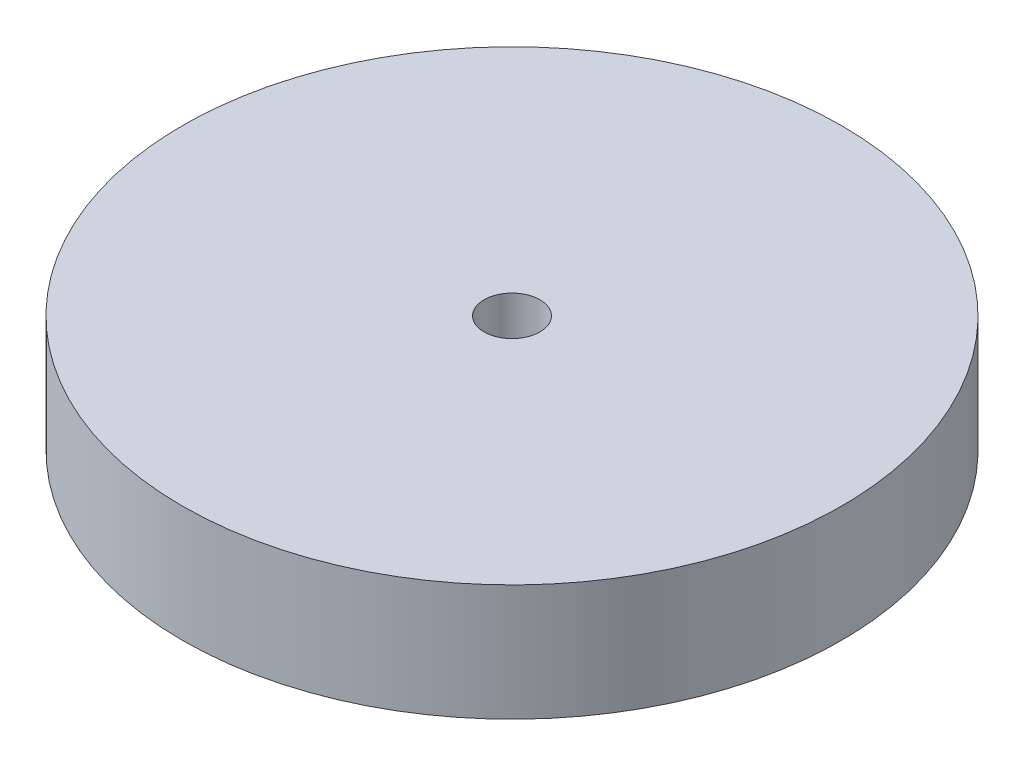
ISO-10303-21;
HEADER;
FILE_DESCRIPTION(('STEP AP214'),'2;1');
FILE_NAME('part.step','',(''),(''),'','','');
FILE_SCHEMA(('AUTOMOTIVE_DESIGN { 1 0 10303 214 1 1 1 1 }'));
ENDSEC;
DATA;
#1=APPLICATION_CONTEXT('core data for automotive mechanical design processes');
#2=APPLICATION_PROTOCOL_DEFINITION('international standard','automotive_design',2000,#1);
#3=PRODUCT_CONTEXT('',#1,'mechanical');
#4=PRODUCT('Part','Part','',(#3));
#5=PRODUCT_RELATED_PRODUCT_CATEGORY('part','',(#4));
#6=PRODUCT_DEFINITION_FORMATION('','',#4);
#7=PRODUCT_DEFINITION_CONTEXT('part definition',#1,'design');
#8=PRODUCT_DEFINITION('design','',#6,#7);
#9=PRODUCT_DEFINITION_SHAPE('','',#8);
#10=(LENGTH_UNIT() NAMED_UNIT(*) SI_UNIT(.MILLI.,.METRE.));
#11=(NAMED_UNIT(*) PLANE_ANGLE_UNIT() SI_UNIT($,.RADIAN.));
#12=(NAMED_UNIT(*) SI_UNIT($,.STERADIAN.) SOLID_ANGLE_UNIT());
#13=UNCERTAINTY_MEASURE_WITH_UNIT(LENGTH_MEASURE(1.E-05),#10,'distance_accuracy_value','');
#14=(GEOMETRIC_REPRESENTATION_CONTEXT(3) GLOBAL_UNCERTAINTY_ASSIGNED_CONTEXT((#13)) GLOBAL_UNIT_ASSIGNED_CONTEXT((#10,
#11,#12)) REPRESENTATION_CONTEXT('',''));
#15=CARTESIAN_POINT('',(0.,0.,0.));
#16=DIRECTION('',(0.,0.,1.));
#17=DIRECTION('',(1.,0.,0.));
#18=AXIS2_PLACEMENT_3D('',#15,#16,#17);
#19=CARTESIAN_POINT('',(0.,29.9999999999999,0.));
#20=DIRECTION('',(0.,-1.,0.));
#21=DIRECTION('',(0.,0.,-1.));
#22=AXIS2_PLACEMENT_3D('',#19,#20,#21);
#23=CYLINDRICAL_SURFACE('',#22,85.);
#24=CARTESIAN_POINT('',(0.,29.9999999999999,0.));
#25=DIRECTION('',(0.,1.,0.));
#26=DIRECTION('',(0.,0.,1.));
#27=AXIS2_PLACEMENT_3D('',#24,#25,#26);
#28=CIRCLE('',#27,85.);
#29=CARTESIAN_POINT('',(0.,29.9999999999999,85.));
#30=VERTEX_POINT('',#29);
#31=EDGE_CURVE('E10',#30,#30,#28,.T.);
#32=ORIENTED_EDGE('',*,*,#31,.F.);
#33=EDGE_LOOP('',(#32));
#34=FACE_BOUND('',#33,.T.);
#35=CARTESIAN_POINT('',(0.,0.,0.));
#36=DIRECTION('',(0.,1.,0.));
#37=DIRECTION('',(0.,0.,1.));
#38=AXIS2_PLACEMENT_3D('',#35,#36,#37);
#39=CIRCLE('',#38,85.);
#40=CARTESIAN_POINT('',(0.,0.,85.));
#41=VERTEX_POINT('',#40);
#42=EDGE_CURVE('E45',#41,#41,#39,.T.);
#43=ORIENTED_EDGE('',*,*,#42,.T.);
#44=EDGE_LOOP('',(#43));
#45=FACE_BOUND('',#44,.T.);
#46=ADVANCED_FACE('F37',(#34,#45),#23,.T.);
#47=CARTESIAN_POINT('',(0.,29.9999999999999,0.));
#48=DIRECTION('',(0.,1.,0.));
#49=DIRECTION('',(0.,0.,1.));
#50=AXIS2_PLACEMENT_3D('',#47,#48,#49);
#51=PLANE('',#50);
#52=CARTESIAN_POINT('',(0.,29.9999999999999,0.));
#53=DIRECTION('',(0.,1.,0.));
#54=DIRECTION('',(0.,0.,1.));
#55=AXIS2_PLACEMENT_3D('',#52,#53,#54);
#56=CIRCLE('',#55,7.2);
#57=CARTESIAN_POINT('',(0.,29.9999999999999,7.2));
#58=VERTEX_POINT('',#57);
#59=EDGE_CURVE('E52',#58,#58,#56,.T.);
#60=ORIENTED_EDGE('',*,*,#59,.F.);
#61=EDGE_LOOP('',(#60));
#62=FACE_BOUND('',#61,.T.);
#63=ORIENTED_EDGE('',*,*,#31,.T.);
#64=EDGE_LOOP('',(#63));
#65=FACE_BOUND('',#64,.T.);
#66=ADVANCED_FACE('F70',(#62,#65),#51,.T.);
#67=CARTESIAN_POINT('',(0.,0.,0.));
#68=DIRECTION('',(0.,1.,0.));
#69=DIRECTION('',(0.,0.,1.));
#70=AXIS2_PLACEMENT_3D('',#67,#68,#69);
#71=PLANE('',#70);
#72=CARTESIAN_POINT('',(0.,0.,0.));
#73=DIRECTION('',(0.,1.,0.));
#74=DIRECTION('',(0.,0.,1.));
#75=AXIS2_PLACEMENT_3D('',#72,#73,#74);
#76=CIRCLE('',#75,7.2);
#77=CARTESIAN_POINT('',(0.,0.,7.2));
#78=VERTEX_POINT('',#77);
#79=EDGE_CURVE('E40',#78,#78,#76,.T.);
#80=ORIENTED_EDGE('',*,*,#79,.T.);
#81=EDGE_LOOP('',(#80));
#82=FACE_BOUND('',#81,.T.);
#83=ORIENTED_EDGE('',*,*,#42,.F.);
#84=EDGE_LOOP('',(#83));
#85=FACE_BOUND('',#84,.T.);
#86=ADVANCED_FACE('F61',(#82,#85),#71,.F.);
#87=CARTESIAN_POINT('',(0.,-90.0000000000001,0.));
#88=DIRECTION('',(0.,1.,0.));
#89=DIRECTION('',(0.,0.,1.));
#90=AXIS2_PLACEMENT_3D('',#87,#88,#89);
#91=CYLINDRICAL_SURFACE('',#90,7.2);
#92=CARTESIAN_POINT('',(0.,29.9999999999999,7.2));
#93=CARTESIAN_POINT('',(0.,29.6874999999999,7.2));
#94=CARTESIAN_POINT('',(0.,29.3749999999999,7.2));
#95=CARTESIAN_POINT('',(0.,28.7499999999999,7.2));
#96=CARTESIAN_POINT('',(0.,28.4374999999999,7.2));
#97=CARTESIAN_POINT('',(0.,27.8124999999999,7.2));
#98=CARTESIAN_POINT('',(0.,27.4999999999999,7.2));
#99=CARTESIAN_POINT('',(0.,26.8749999999999,7.2));
#100=CARTESIAN_POINT('',(0.,26.5624999999999,7.2));
#101=CARTESIAN_POINT('',(0.,25.9374999999999,7.2));
#102=CARTESIAN_POINT('',(0.,25.6249999999999,7.2));
#103=CARTESIAN_POINT('',(0.,24.9999999999999,7.2));
#104=CARTESIAN_POINT('',(0.,24.6874999999999,7.2));
#105=CARTESIAN_POINT('',(0.,24.0624999999999,7.2));
#106=CARTESIAN_POINT('',(0.,23.7499999999999,7.2));
#107=CARTESIAN_POINT('',(0.,23.1249999999999,7.2));
#108=CARTESIAN_POINT('',(0.,22.8124999999999,7.2));
#109=CARTESIAN_POINT('',(0.,22.1874999999999,7.2));
#110=CARTESIAN_POINT('',(0.,21.8749999999999,7.2));
#111=CARTESIAN_POINT('',(0.,21.2499999999999,7.2));
#112=CARTESIAN_POINT('',(0.,20.9374999999999,7.2));
#113=CARTESIAN_POINT('',(0.,20.3124999999999,7.2));
#114=CARTESIAN_POINT('',(0.,19.9999999999999,7.2));
#115=CARTESIAN_POINT('',(0.,19.3749999999999,7.2));
#116=CARTESIAN_POINT('',(0.,19.0624999999999,7.2));
#117=CARTESIAN_POINT('',(0.,18.4375,7.2));
#118=CARTESIAN_POINT('',(0.,18.125,7.2));
#119=CARTESIAN_POINT('',(0.,17.5,7.2));
#120=CARTESIAN_POINT('',(0.,17.1875,7.2));
#121=CARTESIAN_POINT('',(0.,16.5625,7.2));
#122=CARTESIAN_POINT('',(0.,16.25,7.2));
#123=CARTESIAN_POINT('',(0.,15.625,7.2));
#124=CARTESIAN_POINT('',(0.,15.3125,7.2));
#125=CARTESIAN_POINT('',(0.,14.6875,7.2));
#126=CARTESIAN_POINT('',(0.,14.375,7.2));
#127=CARTESIAN_POINT('',(0.,13.75,7.2));
#128=CARTESIAN_POINT('',(0.,13.4375,7.2));
#129=CARTESIAN_POINT('',(0.,12.8125,7.2));
#130=CARTESIAN_POINT('',(0.,12.5,7.2));
#131=CARTESIAN_POINT('',(0.,11.875,7.2));
#132=CARTESIAN_POINT('',(0.,11.5625,7.2));
#133=CARTESIAN_POINT('',(0.,10.9375,7.2));
#134=CARTESIAN_POINT('',(0.,10.625,7.2));
#135=CARTESIAN_POINT('',(0.,9.99999999999997,7.2));
#136=CARTESIAN_POINT('',(0.,9.68749999999997,7.2));
#137=CARTESIAN_POINT('',(0.,9.06249999999997,7.2));
#138=CARTESIAN_POINT('',(0.,8.74999999999997,7.2));
#139=CARTESIAN_POINT('',(0.,8.12499999999998,7.2));
#140=CARTESIAN_POINT('',(0.,7.81249999999998,7.2));
#141=CARTESIAN_POINT('',(0.,7.18749999999998,7.2));
#142=CARTESIAN_POINT('',(0.,6.87499999999998,7.2));
#143=CARTESIAN_POINT('',(0.,6.24999999999999,7.2));
#144=CARTESIAN_POINT('',(0.,5.93749999999999,7.2));
#145=CARTESIAN_POINT('',(0.,5.31249999999999,7.2));
#146=CARTESIAN_POINT('',(0.,4.99999999999999,7.2));
#147=CARTESIAN_POINT('',(0.,4.37499999999999,7.2));
#148=CARTESIAN_POINT('',(0.,4.06249999999999,7.2));
#149=CARTESIAN_POINT('',(0.,3.43749999999999,7.2));
#150=CARTESIAN_POINT('',(0.,3.12499999999999,7.2));
#151=CARTESIAN_POINT('',(0.,2.49999999999999,7.2));
#152=CARTESIAN_POINT('',(0.,2.18749999999999,7.2));
#153=CARTESIAN_POINT('',(0.,1.56249999999999,7.2));
#154=CARTESIAN_POINT('',(0.,1.24999999999999,7.2));
#155=CARTESIAN_POINT('',(0.,0.624999999999996,7.2));
#156=CARTESIAN_POINT('',(0.,0.312499999999998,7.2));
#157=CARTESIAN_POINT('',(0.,0.,7.2));
#158=B_SPLINE_CURVE_WITH_KNOTS('',3,(#92,#93,#94,#95,#96,#97,#98,#99,#100,#101,#102,#103,#104,
#105,#106,#107,#108,#109,#110,#111,#112,#113,#114,#115,#116,#117,#118,#119,#120,#121,#122,#123,
#124,#125,#126,#127,#128,#129,#130,#131,#132,#133,#134,#135,#136,#137,#138,#139,#140,#141,#142,
#143,#144,#145,#146,#147,#148,#149,#150,#151,#152,#153,#154,#155,#156,#157),.UNSPECIFIED.,.F.,
.F.,(4,2,2,2,2,2,2,2,2,2,2,2,2,2,2,2,2,2,2,2,2,2,2,2,2,2,2,2,2,2,2,2,4),(0.,0.937499999999994,
1.87499999999999,2.8125,3.74999999999999,4.68749999999998,5.62499999999999,6.56249999999998,
7.49999999999998,8.43749999999997,9.37499999999997,10.3125,11.25,12.1875,13.125,14.0625,15.,
15.9375,16.8749999999999,17.8125,18.7499999999999,19.6874999999999,20.625,21.5624999999999,
22.4999999999999,23.4374999999999,24.3749999999999,25.3124999999999,26.2499999999999,
27.1874999999999,28.1249999999999,29.0624999999999,29.9999999999999),.UNSPECIFIED.);
#159=EDGE_CURVE('BSEAM64',#58,#78,#158,.T.);
#160=ORIENTED_EDGE('',*,*,#59,.T.);
#161=ORIENTED_EDGE('',*,*,#79,.F.);
#162=ORIENTED_EDGE('',*,*,#159,.T.);
#163=ORIENTED_EDGE('',*,*,#159,.F.);
#164=EDGE_LOOP('',(#160,#162,#161,#163));
#165=FACE_BOUND('',#164,.T.);
#166=ADVANCED_FACE('F64',(#165),#91,.F.);
#167=CLOSED_SHELL('',(#46,#66,#86,#166));
#168=MANIFOLD_SOLID_BREP('B2',#167);
#169=ADVANCED_BREP_SHAPE_REPRESENTATION('',(#18,#168),#14);
#170=SHAPE_DEFINITION_REPRESENTATION(#9,#169);
ENDSEC;
END-ISO-10303-21;
